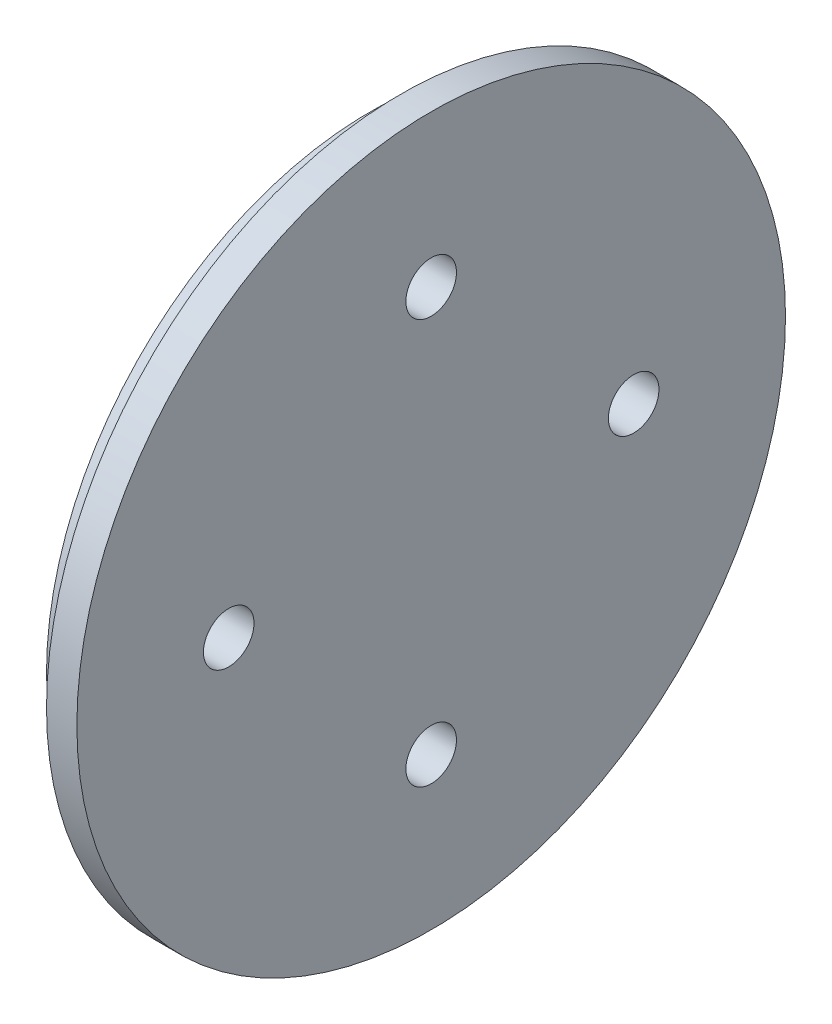
ISO-10303-21;
HEADER;
FILE_DESCRIPTION(('STEP AP214'),'2;1');
FILE_NAME('part.step','',(''),(''),'','','');
FILE_SCHEMA(('AUTOMOTIVE_DESIGN { 1 0 10303 214 1 1 1 1 }'));
ENDSEC;
DATA;
#1=APPLICATION_CONTEXT('core data for automotive mechanical design processes');
#2=APPLICATION_PROTOCOL_DEFINITION('international standard','automotive_design',2000,#1);
#3=PRODUCT_CONTEXT('',#1,'mechanical');
#4=PRODUCT('Part','Part','',(#3));
#5=PRODUCT_RELATED_PRODUCT_CATEGORY('part','',(#4));
#6=PRODUCT_DEFINITION_FORMATION('','',#4);
#7=PRODUCT_DEFINITION_CONTEXT('part definition',#1,'design');
#8=PRODUCT_DEFINITION('design','',#6,#7);
#9=PRODUCT_DEFINITION_SHAPE('','',#8);
#10=(LENGTH_UNIT() NAMED_UNIT(*) SI_UNIT(.MILLI.,.METRE.));
#11=(NAMED_UNIT(*) PLANE_ANGLE_UNIT() SI_UNIT($,.RADIAN.));
#12=(NAMED_UNIT(*) SI_UNIT($,.STERADIAN.) SOLID_ANGLE_UNIT());
#13=UNCERTAINTY_MEASURE_WITH_UNIT(LENGTH_MEASURE(1.E-05),#10,'distance_accuracy_value','');
#14=(GEOMETRIC_REPRESENTATION_CONTEXT(3) GLOBAL_UNCERTAINTY_ASSIGNED_CONTEXT((#13)) GLOBAL_UNIT_ASSIGNED_CONTEXT((#10,
#11,#12)) REPRESENTATION_CONTEXT('',''));
#15=CARTESIAN_POINT('',(0.,0.,0.));
#16=DIRECTION('',(0.,0.,1.));
#17=DIRECTION('',(1.,0.,0.));
#18=AXIS2_PLACEMENT_3D('',#15,#16,#17);
#19=CARTESIAN_POINT('',(6.,0.,0.));
#20=DIRECTION('',(-1.,0.,0.));
#21=DIRECTION('',(0.,0.,1.));
#22=AXIS2_PLACEMENT_3D('',#19,#20,#21);
#23=PLANE('',#22);
#24=CARTESIAN_POINT('',(6.,0.,20.));
#25=DIRECTION('',(-1.,0.,0.));
#26=DIRECTION('',(0.,0.,1.));
#27=AXIS2_PLACEMENT_3D('',#24,#25,#26);
#28=CIRCLE('',#27,2.5);
#29=CARTESIAN_POINT('',(6.,0.,22.5));
#30=VERTEX_POINT('',#29);
#31=EDGE_CURVE('E80',#30,#30,#28,.T.);
#32=ORIENTED_EDGE('',*,*,#31,.T.);
#33=EDGE_LOOP('',(#32));
#34=FACE_BOUND('',#33,.T.);
#35=CARTESIAN_POINT('',(6.,-20.,0.));
#36=DIRECTION('',(-1.,0.,0.));
#37=DIRECTION('',(0.,0.,1.));
#38=AXIS2_PLACEMENT_3D('',#35,#36,#37);
#39=CIRCLE('',#38,2.5);
#40=CARTESIAN_POINT('',(6.,-20.,2.5));
#41=VERTEX_POINT('',#40);
#42=EDGE_CURVE('E84',#41,#41,#39,.T.);
#43=ORIENTED_EDGE('',*,*,#42,.T.);
#44=EDGE_LOOP('',(#43));
#45=FACE_BOUND('',#44,.T.);
#46=CARTESIAN_POINT('',(6.,2.09488880330588E-13,-20.));
#47=DIRECTION('',(-1.,0.,0.));
#48=DIRECTION('',(0.,0.,1.));
#49=AXIS2_PLACEMENT_3D('',#46,#47,#48);
#50=CIRCLE('',#49,2.5);
#51=CARTESIAN_POINT('',(6.,2.09488880330588E-13,-17.5));
#52=VERTEX_POINT('',#51);
#53=EDGE_CURVE('E88',#52,#52,#50,.T.);
#54=ORIENTED_EDGE('',*,*,#53,.T.);
#55=EDGE_LOOP('',(#54));
#56=FACE_BOUND('',#55,.T.);
#57=CARTESIAN_POINT('',(6.,20.,0.));
#58=DIRECTION('',(-1.,0.,0.));
#59=DIRECTION('',(0.,0.,1.));
#60=AXIS2_PLACEMENT_3D('',#57,#58,#59);
#61=CIRCLE('',#60,2.5);
#62=CARTESIAN_POINT('',(6.,20.,2.5));
#63=VERTEX_POINT('',#62);
#64=EDGE_CURVE('E72',#63,#63,#61,.T.);
#65=ORIENTED_EDGE('',*,*,#64,.T.);
#66=EDGE_LOOP('',(#65));
#67=FACE_BOUND('',#66,.T.);
#68=CARTESIAN_POINT('',(6.,0.,0.));
#69=DIRECTION('',(-1.,0.,0.));
#70=DIRECTION('',(0.,0.,1.));
#71=AXIS2_PLACEMENT_3D('',#68,#69,#70);
#72=CIRCLE('',#71,35.);
#73=CARTESIAN_POINT('',(6.,0.,35.));
#74=VERTEX_POINT('',#73);
#75=EDGE_CURVE('E10',#74,#74,#72,.T.);
#76=ORIENTED_EDGE('',*,*,#75,.F.);
#77=EDGE_LOOP('',(#76));
#78=FACE_BOUND('',#77,.T.);
#79=ADVANCED_FACE('F41',(#34,#45,#56,#67,#78),#23,.F.);
#80=CARTESIAN_POINT('',(0.,0.,0.));
#81=DIRECTION('',(-1.,0.,0.));
#82=DIRECTION('',(0.,0.,1.));
#83=AXIS2_PLACEMENT_3D('',#80,#81,#82);
#84=CYLINDRICAL_SURFACE('',#83,35.);
#85=CARTESIAN_POINT('',(3.,0.,0.));
#86=DIRECTION('',(-1.,0.,0.));
#87=DIRECTION('',(0.,0.,1.));
#88=AXIS2_PLACEMENT_3D('',#85,#86,#87);
#89=CIRCLE('',#88,35.);
#90=CARTESIAN_POINT('',(3.,0.,35.));
#91=VERTEX_POINT('',#90);
#92=EDGE_CURVE('E48',#91,#91,#89,.T.);
#93=ORIENTED_EDGE('',*,*,#92,.F.);
#94=EDGE_LOOP('',(#93));
#95=FACE_BOUND('',#94,.T.);
#96=ORIENTED_EDGE('',*,*,#75,.T.);
#97=EDGE_LOOP('',(#96));
#98=FACE_BOUND('',#97,.T.);
#99=ADVANCED_FACE('F131',(#95,#98),#84,.T.);
#100=CARTESIAN_POINT('',(3.,35.,0.));
#101=DIRECTION('',(1.,0.,0.));
#102=DIRECTION('',(0.,0.,-1.));
#103=AXIS2_PLACEMENT_3D('',#100,#101,#102);
#104=PLANE('',#103);
#105=CARTESIAN_POINT('',(3.,0.,0.));
#106=DIRECTION('',(-1.,0.,0.));
#107=DIRECTION('',(0.,0.,1.));
#108=AXIS2_PLACEMENT_3D('',#105,#106,#107);
#109=CIRCLE('',#108,32.);
#110=CARTESIAN_POINT('',(3.,0.,32.));
#111=VERTEX_POINT('',#110);
#112=EDGE_CURVE('E53',#111,#111,#109,.T.);
#113=ORIENTED_EDGE('',*,*,#112,.F.);
#114=EDGE_LOOP('',(#113));
#115=FACE_BOUND('',#114,.T.);
#116=ORIENTED_EDGE('',*,*,#92,.T.);
#117=EDGE_LOOP('',(#116));
#118=FACE_BOUND('',#117,.T.);
#119=ADVANCED_FACE('F126',(#115,#118),#104,.F.);
#120=CARTESIAN_POINT('',(0.,0.,0.));
#121=DIRECTION('',(-1.,0.,0.));
#122=DIRECTION('',(0.,0.,1.));
#123=AXIS2_PLACEMENT_3D('',#120,#121,#122);
#124=CYLINDRICAL_SURFACE('',#123,32.);
#125=CARTESIAN_POINT('',(0.,0.,0.));
#126=DIRECTION('',(-1.,0.,0.));
#127=DIRECTION('',(0.,0.,1.));
#128=AXIS2_PLACEMENT_3D('',#125,#126,#127);
#129=CIRCLE('',#128,32.);
#130=CARTESIAN_POINT('',(0.,0.,32.));
#131=VERTEX_POINT('',#130);
#132=EDGE_CURVE('E58',#131,#131,#129,.T.);
#133=ORIENTED_EDGE('',*,*,#132,.F.);
#134=EDGE_LOOP('',(#133));
#135=FACE_BOUND('',#134,.T.);
#136=ORIENTED_EDGE('',*,*,#112,.T.);
#137=EDGE_LOOP('',(#136));
#138=FACE_BOUND('',#137,.T.);
#139=ADVANCED_FACE('F112',(#135,#138),#124,.T.);
#140=CARTESIAN_POINT('',(0.,32.,0.));
#141=DIRECTION('',(1.,0.,0.));
#142=DIRECTION('',(0.,0.,-1.));
#143=AXIS2_PLACEMENT_3D('',#140,#141,#142);
#144=PLANE('',#143);
#145=CARTESIAN_POINT('',(0.,0.,20.));
#146=DIRECTION('',(-1.,0.,0.));
#147=DIRECTION('',(0.,-1.,0.));
#148=AXIS2_PLACEMENT_3D('',#145,#146,#147);
#149=CIRCLE('',#148,2.5);
#150=CARTESIAN_POINT('',(0.,-2.50000000000007,20.));
#151=VERTEX_POINT('',#150);
#152=EDGE_CURVE('E92',#151,#151,#149,.T.);
#153=ORIENTED_EDGE('',*,*,#152,.F.);
#154=EDGE_LOOP('',(#153));
#155=FACE_BOUND('',#154,.T.);
#156=CARTESIAN_POINT('',(0.,-20.,0.));
#157=DIRECTION('',(-1.,0.,0.));
#158=DIRECTION('',(0.,0.,-1.));
#159=AXIS2_PLACEMENT_3D('',#156,#157,#158);
#160=CIRCLE('',#159,2.5);
#161=CARTESIAN_POINT('',(0.,-20.,-2.5));
#162=VERTEX_POINT('',#161);
#163=EDGE_CURVE('E97',#162,#162,#160,.T.);
#164=ORIENTED_EDGE('',*,*,#163,.F.);
#165=EDGE_LOOP('',(#164));
#166=FACE_BOUND('',#165,.T.);
#167=CARTESIAN_POINT('',(0.,2.09488880330588E-13,-20.));
#168=DIRECTION('',(-1.,0.,0.));
#169=DIRECTION('',(0.,1.,0.));
#170=AXIS2_PLACEMENT_3D('',#167,#168,#169);
#171=CIRCLE('',#170,2.5);
#172=CARTESIAN_POINT('',(0.,2.50000000000021,-20.));
#173=VERTEX_POINT('',#172);
#174=EDGE_CURVE('E93',#173,#173,#171,.T.);
#175=ORIENTED_EDGE('',*,*,#174,.F.);
#176=EDGE_LOOP('',(#175));
#177=FACE_BOUND('',#176,.T.);
#178=CARTESIAN_POINT('',(0.,20.,0.));
#179=DIRECTION('',(-1.,0.,0.));
#180=DIRECTION('',(0.,0.,1.));
#181=AXIS2_PLACEMENT_3D('',#178,#179,#180);
#182=CIRCLE('',#181,2.5);
#183=CARTESIAN_POINT('',(0.,20.,2.5));
#184=VERTEX_POINT('',#183);
#185=EDGE_CURVE('E76',#184,#184,#182,.T.);
#186=ORIENTED_EDGE('',*,*,#185,.F.);
#187=EDGE_LOOP('',(#186));
#188=FACE_BOUND('',#187,.T.);
#189=CARTESIAN_POINT('',(0.,0.,0.));
#190=DIRECTION('',(-1.,0.,0.));
#191=DIRECTION('',(0.,0.,1.));
#192=AXIS2_PLACEMENT_3D('',#189,#190,#191);
#193=CIRCLE('',#192,15.);
#194=CARTESIAN_POINT('',(0.,0.,15.));
#195=VERTEX_POINT('',#194);
#196=EDGE_CURVE('E64',#195,#195,#193,.T.);
#197=ORIENTED_EDGE('',*,*,#196,.F.);
#198=EDGE_LOOP('',(#197));
#199=FACE_BOUND('',#198,.T.);
#200=ORIENTED_EDGE('',*,*,#132,.T.);
#201=EDGE_LOOP('',(#200));
#202=FACE_BOUND('',#201,.T.);
#203=ADVANCED_FACE('F108',(#155,#166,#177,#188,#199,#202),#144,.F.);
#204=CARTESIAN_POINT('',(0.,0.,0.));
#205=DIRECTION('',(-1.,0.,0.));
#206=DIRECTION('',(0.,0.,1.));
#207=AXIS2_PLACEMENT_3D('',#204,#205,#206);
#208=CYLINDRICAL_SURFACE('',#207,15.);
#209=CARTESIAN_POINT('',(2.,0.,0.));
#210=DIRECTION('',(-1.,0.,0.));
#211=DIRECTION('',(0.,0.,1.));
#212=AXIS2_PLACEMENT_3D('',#209,#210,#211);
#213=CIRCLE('',#212,15.);
#214=CARTESIAN_POINT('',(2.,0.,15.));
#215=VERTEX_POINT('',#214);
#216=EDGE_CURVE('E68',#215,#215,#213,.T.);
#217=ORIENTED_EDGE('',*,*,#216,.F.);
#218=EDGE_LOOP('',(#217));
#219=FACE_BOUND('',#218,.T.);
#220=ORIENTED_EDGE('',*,*,#196,.T.);
#221=EDGE_LOOP('',(#220));
#222=FACE_BOUND('',#221,.T.);
#223=ADVANCED_FACE('F111',(#219,#222),#208,.F.);
#224=CARTESIAN_POINT('',(2.,15.,0.));
#225=DIRECTION('',(1.,0.,0.));
#226=DIRECTION('',(0.,0.,-1.));
#227=AXIS2_PLACEMENT_3D('',#224,#225,#226);
#228=PLANE('',#227);
#229=ORIENTED_EDGE('',*,*,#216,.T.);
#230=EDGE_LOOP('',(#229));
#231=FACE_BOUND('',#230,.T.);
#232=ADVANCED_FACE('F153',(#231),#228,.F.);
#233=CARTESIAN_POINT('',(33.3,20.,0.));
#234=DIRECTION('',(-1.,0.,0.));
#235=DIRECTION('',(0.,0.,1.));
#236=AXIS2_PLACEMENT_3D('',#233,#234,#235);
#237=CYLINDRICAL_SURFACE('',#236,2.5);
#238=ORIENTED_EDGE('',*,*,#185,.T.);
#239=EDGE_LOOP('',(#238));
#240=FACE_BOUND('',#239,.T.);
#241=ORIENTED_EDGE('',*,*,#64,.F.);
#242=EDGE_LOOP('',(#241));
#243=FACE_BOUND('',#242,.T.);
#244=ADVANCED_FACE('F150',(#240,#243),#237,.F.);
#245=CARTESIAN_POINT('',(33.3,2.09488880330588E-13,-20.));
#246=DIRECTION('',(-1.,0.,0.));
#247=DIRECTION('',(0.,0.,1.));
#248=AXIS2_PLACEMENT_3D('',#245,#246,#247);
#249=CYLINDRICAL_SURFACE('',#248,2.5);
#250=ORIENTED_EDGE('',*,*,#174,.T.);
#251=EDGE_LOOP('',(#250));
#252=FACE_BOUND('',#251,.T.);
#253=ORIENTED_EDGE('',*,*,#53,.F.);
#254=EDGE_LOOP('',(#253));
#255=FACE_BOUND('',#254,.T.);
#256=ADVANCED_FACE('F152',(#252,#255),#249,.F.);
#257=CARTESIAN_POINT('',(33.3,-20.,0.));
#258=DIRECTION('',(-1.,0.,0.));
#259=DIRECTION('',(0.,0.,1.));
#260=AXIS2_PLACEMENT_3D('',#257,#258,#259);
#261=CYLINDRICAL_SURFACE('',#260,2.5);
#262=ORIENTED_EDGE('',*,*,#163,.T.);
#263=EDGE_LOOP('',(#262));
#264=FACE_BOUND('',#263,.T.);
#265=ORIENTED_EDGE('',*,*,#42,.F.);
#266=EDGE_LOOP('',(#265));
#267=FACE_BOUND('',#266,.T.);
#268=ADVANCED_FACE('F160',(#264,#267),#261,.F.);
#269=CARTESIAN_POINT('',(33.3,0.,20.));
#270=DIRECTION('',(-1.,0.,0.));
#271=DIRECTION('',(0.,0.,1.));
#272=AXIS2_PLACEMENT_3D('',#269,#270,#271);
#273=CYLINDRICAL_SURFACE('',#272,2.5);
#274=ORIENTED_EDGE('',*,*,#152,.T.);
#275=EDGE_LOOP('',(#274));
#276=FACE_BOUND('',#275,.T.);
#277=ORIENTED_EDGE('',*,*,#31,.F.);
#278=EDGE_LOOP('',(#277));
#279=FACE_BOUND('',#278,.T.);
#280=ADVANCED_FACE('F105',(#276,#279),#273,.F.);
#281=CLOSED_SHELL('',(#79,#99,#119,#139,#203,#223,#232,#244,#256,#268,#280));
#282=MANIFOLD_SOLID_BREP('B2',#281);
#283=ADVANCED_BREP_SHAPE_REPRESENTATION('',(#18,#282),#14);
#284=SHAPE_DEFINITION_REPRESENTATION(#9,#283);
ENDSEC;
END-ISO-10303-21;
